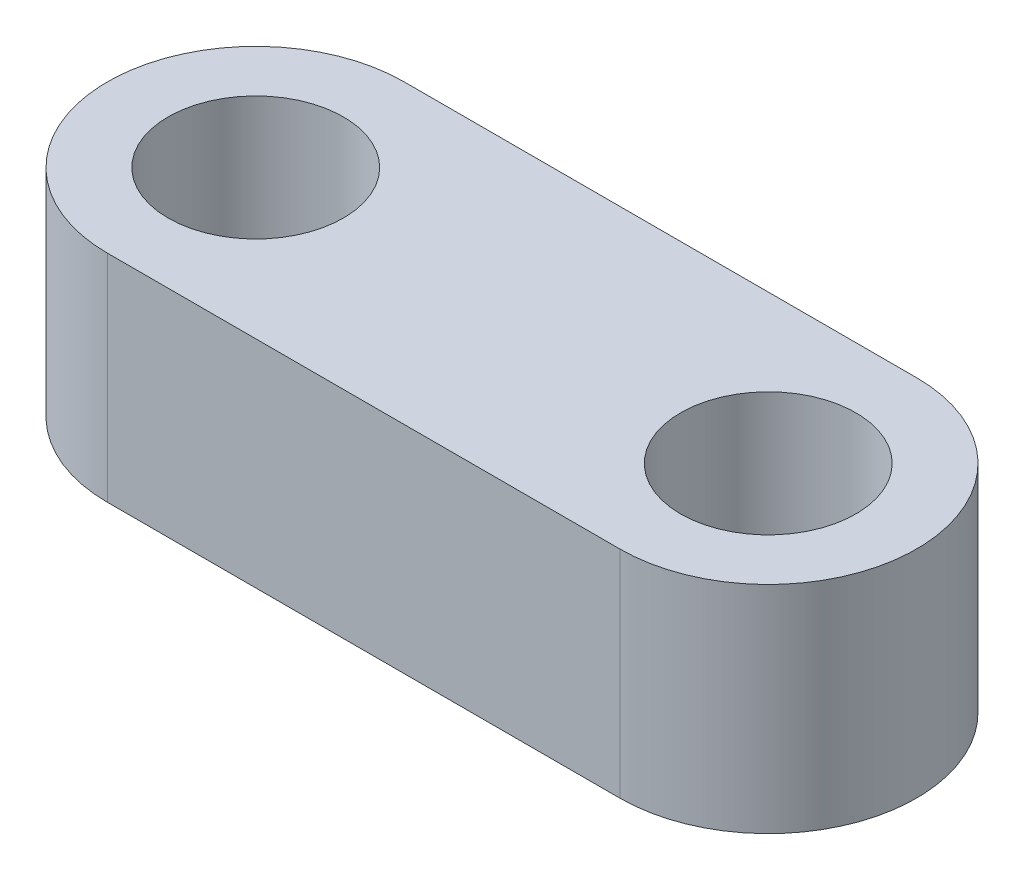
ISO-10303-21;
HEADER;
FILE_DESCRIPTION(('STEP AP214'),'2;1');
FILE_NAME('part.step','',(''),(''),'','','');
FILE_SCHEMA(('AUTOMOTIVE_DESIGN { 1 0 10303 214 1 1 1 1 }'));
ENDSEC;
DATA;
#1=APPLICATION_CONTEXT('core data for automotive mechanical design processes');
#2=APPLICATION_PROTOCOL_DEFINITION('international standard','automotive_design',2000,#1);
#3=PRODUCT_CONTEXT('',#1,'mechanical');
#4=PRODUCT('Part','Part','',(#3));
#5=PRODUCT_RELATED_PRODUCT_CATEGORY('part','',(#4));
#6=PRODUCT_DEFINITION_FORMATION('','',#4);
#7=PRODUCT_DEFINITION_CONTEXT('part definition',#1,'design');
#8=PRODUCT_DEFINITION('design','',#6,#7);
#9=PRODUCT_DEFINITION_SHAPE('','',#8);
#10=(LENGTH_UNIT() NAMED_UNIT(*) SI_UNIT(.MILLI.,.METRE.));
#11=(NAMED_UNIT(*) PLANE_ANGLE_UNIT() SI_UNIT($,.RADIAN.));
#12=(NAMED_UNIT(*) SI_UNIT($,.STERADIAN.) SOLID_ANGLE_UNIT());
#13=UNCERTAINTY_MEASURE_WITH_UNIT(LENGTH_MEASURE(1.E-05),#10,'distance_accuracy_value','');
#14=(GEOMETRIC_REPRESENTATION_CONTEXT(3) GLOBAL_UNCERTAINTY_ASSIGNED_CONTEXT((#13)) GLOBAL_UNIT_ASSIGNED_CONTEXT((#10,
#11,#12)) REPRESENTATION_CONTEXT('',''));
#15=CARTESIAN_POINT('',(0.,0.,0.));
#16=DIRECTION('',(0.,0.,1.));
#17=DIRECTION('',(1.,0.,0.));
#18=AXIS2_PLACEMENT_3D('',#15,#16,#17);
#19=CARTESIAN_POINT('',(0.,4.,0.));
#20=DIRECTION('',(0.,1.,0.));
#21=DIRECTION('',(0.,0.,1.));
#22=AXIS2_PLACEMENT_3D('',#19,#20,#21);
#23=PLANE('',#22);
#24=CARTESIAN_POINT('',(0.,4.,0.));
#25=DIRECTION('',(0.,1.,0.));
#26=DIRECTION('',(0.,0.,1.));
#27=AXIS2_PLACEMENT_3D('',#24,#25,#26);
#28=CIRCLE('',#27,1.625);
#29=CARTESIAN_POINT('',(0.,4.,1.625));
#30=VERTEX_POINT('',#29);
#31=EDGE_CURVE('E100',#30,#30,#28,.T.);
#32=ORIENTED_EDGE('',*,*,#31,.F.);
#33=EDGE_LOOP('',(#32));
#34=FACE_BOUND('',#33,.T.);
#35=CARTESIAN_POINT('',(0.,4.,0.));
#36=DIRECTION('',(0.,1.,0.));
#37=DIRECTION('',(0.,0.,1.));
#38=AXIS2_PLACEMENT_3D('',#35,#36,#37);
#39=CIRCLE('',#38,2.75);
#40=CARTESIAN_POINT('',(0.,4.,-2.75));
#41=VERTEX_POINT('',#40);
#42=CARTESIAN_POINT('',(0.,4.,2.75));
#43=VERTEX_POINT('',#42);
#44=EDGE_CURVE('E85',#41,#43,#39,.T.);
#45=ORIENTED_EDGE('',*,*,#44,.T.);
#46=DIRECTION('',(1.,0.,0.));
#47=VECTOR('',#46,1.);
#48=CARTESIAN_POINT('',(0.,4.,2.75));
#49=LINE('',#48,#47);
#50=CARTESIAN_POINT('',(9.5,4.,2.75));
#51=VERTEX_POINT('',#50);
#52=EDGE_CURVE('E80',#43,#51,#49,.T.);
#53=ORIENTED_EDGE('',*,*,#52,.T.);
#54=CARTESIAN_POINT('',(9.5,4.,0.));
#55=DIRECTION('',(0.,1.,0.));
#56=DIRECTION('',(0.,0.,1.));
#57=AXIS2_PLACEMENT_3D('',#54,#55,#56);
#58=CIRCLE('',#57,2.75);
#59=CARTESIAN_POINT('',(9.5,4.,-2.75));
#60=VERTEX_POINT('',#59);
#61=EDGE_CURVE('E83',#51,#60,#58,.T.);
#62=ORIENTED_EDGE('',*,*,#61,.T.);
#63=DIRECTION('',(-1.,0.,0.));
#64=VECTOR('',#63,1.);
#65=CARTESIAN_POINT('',(0.,4.,-2.75));
#66=LINE('',#65,#64);
#67=EDGE_CURVE('E50',#60,#41,#66,.T.);
#68=ORIENTED_EDGE('',*,*,#67,.T.);
#69=EDGE_LOOP('',(#45,#53,#62,#68));
#70=FACE_BOUND('',#69,.T.);
#71=CARTESIAN_POINT('',(9.5,4.,0.));
#72=DIRECTION('',(0.,1.,0.));
#73=DIRECTION('',(0.,0.,1.));
#74=AXIS2_PLACEMENT_3D('',#71,#72,#73);
#75=CIRCLE('',#74,1.625);
#76=CARTESIAN_POINT('',(9.5,4.,1.625));
#77=VERTEX_POINT('',#76);
#78=EDGE_CURVE('E115',#77,#77,#75,.T.);
#79=ORIENTED_EDGE('',*,*,#78,.F.);
#80=EDGE_LOOP('',(#79));
#81=FACE_BOUND('',#80,.T.);
#82=ADVANCED_FACE('F33',(#34,#70,#81),#23,.T.);
#83=CARTESIAN_POINT('',(0.,0.,0.));
#84=DIRECTION('',(0.,1.,0.));
#85=DIRECTION('',(0.,0.,1.));
#86=AXIS2_PLACEMENT_3D('',#83,#84,#85);
#87=PLANE('',#86);
#88=CARTESIAN_POINT('',(0.,0.,0.));
#89=DIRECTION('',(0.,1.,0.));
#90=DIRECTION('',(0.,0.,1.));
#91=AXIS2_PLACEMENT_3D('',#88,#89,#90);
#92=CIRCLE('',#91,2.75);
#93=CARTESIAN_POINT('',(0.,0.,-2.75));
#94=VERTEX_POINT('',#93);
#95=CARTESIAN_POINT('',(0.,0.,2.75));
#96=VERTEX_POINT('',#95);
#97=EDGE_CURVE('E97',#94,#96,#92,.T.);
#98=ORIENTED_EDGE('',*,*,#97,.F.);
#99=DIRECTION('',(-1.,0.,0.));
#100=VECTOR('',#99,1.);
#101=CARTESIAN_POINT('',(0.,0.,-2.75));
#102=LINE('',#101,#100);
#103=CARTESIAN_POINT('',(9.5,0.,-2.75));
#104=VERTEX_POINT('',#103);
#105=EDGE_CURVE('E73',#104,#94,#102,.T.);
#106=ORIENTED_EDGE('',*,*,#105,.F.);
#107=CARTESIAN_POINT('',(9.5,0.,0.));
#108=DIRECTION('',(0.,1.,0.));
#109=DIRECTION('',(0.,0.,1.));
#110=AXIS2_PLACEMENT_3D('',#107,#108,#109);
#111=CIRCLE('',#110,2.75);
#112=CARTESIAN_POINT('',(9.5,0.,2.75));
#113=VERTEX_POINT('',#112);
#114=EDGE_CURVE('E67',#113,#104,#111,.T.);
#115=ORIENTED_EDGE('',*,*,#114,.F.);
#116=DIRECTION('',(1.,0.,0.));
#117=VECTOR('',#116,1.);
#118=CARTESIAN_POINT('',(0.,0.,2.75));
#119=LINE('',#118,#117);
#120=EDGE_CURVE('E89',#96,#113,#119,.T.);
#121=ORIENTED_EDGE('',*,*,#120,.F.);
#122=EDGE_LOOP('',(#98,#106,#115,#121));
#123=FACE_BOUND('',#122,.T.);
#124=CARTESIAN_POINT('',(0.,0.,0.));
#125=DIRECTION('',(0.,1.,0.));
#126=DIRECTION('',(0.,0.,1.));
#127=AXIS2_PLACEMENT_3D('',#124,#125,#126);
#128=CIRCLE('',#127,1.625);
#129=CARTESIAN_POINT('',(0.,0.,1.625));
#130=VERTEX_POINT('',#129);
#131=EDGE_CURVE('E112',#130,#130,#128,.T.);
#132=ORIENTED_EDGE('',*,*,#131,.T.);
#133=EDGE_LOOP('',(#132));
#134=FACE_BOUND('',#133,.T.);
#135=CARTESIAN_POINT('',(9.5,0.,0.));
#136=DIRECTION('',(0.,1.,0.));
#137=DIRECTION('',(0.,0.,1.));
#138=AXIS2_PLACEMENT_3D('',#135,#136,#137);
#139=CIRCLE('',#138,1.625);
#140=CARTESIAN_POINT('',(9.5,0.,1.625));
#141=VERTEX_POINT('',#140);
#142=EDGE_CURVE('E118',#141,#141,#139,.T.);
#143=ORIENTED_EDGE('',*,*,#142,.T.);
#144=EDGE_LOOP('',(#143));
#145=FACE_BOUND('',#144,.T.);
#146=ADVANCED_FACE('F108',(#123,#134,#145),#87,.F.);
#147=CARTESIAN_POINT('',(0.,4.,0.));
#148=DIRECTION('',(0.,-1.,0.));
#149=DIRECTION('',(0.,0.,-1.));
#150=AXIS2_PLACEMENT_3D('',#147,#148,#149);
#151=CYLINDRICAL_SURFACE('',#150,2.75);
#152=ORIENTED_EDGE('',*,*,#97,.T.);
#153=DIRECTION('',(0.,-1.,0.));
#154=VECTOR('',#153,1.);
#155=CARTESIAN_POINT('',(0.,4.,2.75));
#156=LINE('',#155,#154);
#157=EDGE_CURVE('E11',#43,#96,#156,.T.);
#158=ORIENTED_EDGE('',*,*,#157,.F.);
#159=ORIENTED_EDGE('',*,*,#44,.F.);
#160=DIRECTION('',(0.,-1.,0.));
#161=VECTOR('',#160,1.);
#162=CARTESIAN_POINT('',(0.,4.,-2.75));
#163=LINE('',#162,#161);
#164=EDGE_CURVE('E93',#41,#94,#163,.T.);
#165=ORIENTED_EDGE('',*,*,#164,.T.);
#166=EDGE_LOOP('',(#152,#158,#159,#165));
#167=FACE_BOUND('',#166,.T.);
#168=ADVANCED_FACE('F35',(#167),#151,.T.);
#169=CARTESIAN_POINT('',(0.,4.,2.75));
#170=DIRECTION('',(0.,0.,-1.));
#171=DIRECTION('',(-1.,0.,0.));
#172=AXIS2_PLACEMENT_3D('',#169,#170,#171);
#173=PLANE('',#172);
#174=ORIENTED_EDGE('',*,*,#120,.T.);
#175=DIRECTION('',(0.,-1.,0.));
#176=VECTOR('',#175,1.);
#177=CARTESIAN_POINT('',(9.5,4.,2.75));
#178=LINE('',#177,#176);
#179=EDGE_CURVE('E42',#51,#113,#178,.T.);
#180=ORIENTED_EDGE('',*,*,#179,.F.);
#181=ORIENTED_EDGE('',*,*,#52,.F.);
#182=ORIENTED_EDGE('',*,*,#157,.T.);
#183=EDGE_LOOP('',(#174,#180,#181,#182));
#184=FACE_BOUND('',#183,.T.);
#185=ADVANCED_FACE('F88',(#184),#173,.F.);
#186=CARTESIAN_POINT('',(9.5,4.,0.));
#187=DIRECTION('',(0.,-1.,0.));
#188=DIRECTION('',(0.,0.,-1.));
#189=AXIS2_PLACEMENT_3D('',#186,#187,#188);
#190=CYLINDRICAL_SURFACE('',#189,2.75);
#191=ORIENTED_EDGE('',*,*,#114,.T.);
#192=DIRECTION('',(0.,-1.,0.));
#193=VECTOR('',#192,1.);
#194=CARTESIAN_POINT('',(9.5,4.,-2.75));
#195=LINE('',#194,#193);
#196=EDGE_CURVE('E90',#60,#104,#195,.T.);
#197=ORIENTED_EDGE('',*,*,#196,.F.);
#198=ORIENTED_EDGE('',*,*,#61,.F.);
#199=ORIENTED_EDGE('',*,*,#179,.T.);
#200=EDGE_LOOP('',(#191,#197,#198,#199));
#201=FACE_BOUND('',#200,.T.);
#202=ADVANCED_FACE('F91',(#201),#190,.T.);
#203=CARTESIAN_POINT('',(0.,4.,-2.75));
#204=DIRECTION('',(0.,0.,1.));
#205=DIRECTION('',(1.,0.,0.));
#206=AXIS2_PLACEMENT_3D('',#203,#204,#205);
#207=PLANE('',#206);
#208=ORIENTED_EDGE('',*,*,#105,.T.);
#209=ORIENTED_EDGE('',*,*,#164,.F.);
#210=ORIENTED_EDGE('',*,*,#67,.F.);
#211=ORIENTED_EDGE('',*,*,#196,.T.);
#212=EDGE_LOOP('',(#208,#209,#210,#211));
#213=FACE_BOUND('',#212,.T.);
#214=ADVANCED_FACE('F105',(#213),#207,.F.);
#215=CARTESIAN_POINT('',(0.,4.,0.));
#216=DIRECTION('',(0.,-1.,0.));
#217=DIRECTION('',(0.,0.,-1.));
#218=AXIS2_PLACEMENT_3D('',#215,#216,#217);
#219=CYLINDRICAL_SURFACE('',#218,1.625);
#220=ORIENTED_EDGE('',*,*,#31,.T.);
#221=EDGE_LOOP('',(#220));
#222=FACE_BOUND('',#221,.T.);
#223=ORIENTED_EDGE('',*,*,#131,.F.);
#224=EDGE_LOOP('',(#223));
#225=FACE_BOUND('',#224,.T.);
#226=ADVANCED_FACE('F135',(#222,#225),#219,.F.);
#227=CARTESIAN_POINT('',(9.5,4.,0.));
#228=DIRECTION('',(0.,-1.,0.));
#229=DIRECTION('',(0.,0.,-1.));
#230=AXIS2_PLACEMENT_3D('',#227,#228,#229);
#231=CYLINDRICAL_SURFACE('',#230,1.625);
#232=ORIENTED_EDGE('',*,*,#78,.T.);
#233=EDGE_LOOP('',(#232));
#234=FACE_BOUND('',#233,.T.);
#235=ORIENTED_EDGE('',*,*,#142,.F.);
#236=EDGE_LOOP('',(#235));
#237=FACE_BOUND('',#236,.T.);
#238=ADVANCED_FACE('F124',(#234,#237),#231,.F.);
#239=CLOSED_SHELL('',(#82,#146,#168,#185,#202,#214,#226,#238));
#240=MANIFOLD_SOLID_BREP('B2',#239);
#241=ADVANCED_BREP_SHAPE_REPRESENTATION('',(#18,#240),#14);
#242=SHAPE_DEFINITION_REPRESENTATION(#9,#241);
ENDSEC;
END-ISO-10303-21;
